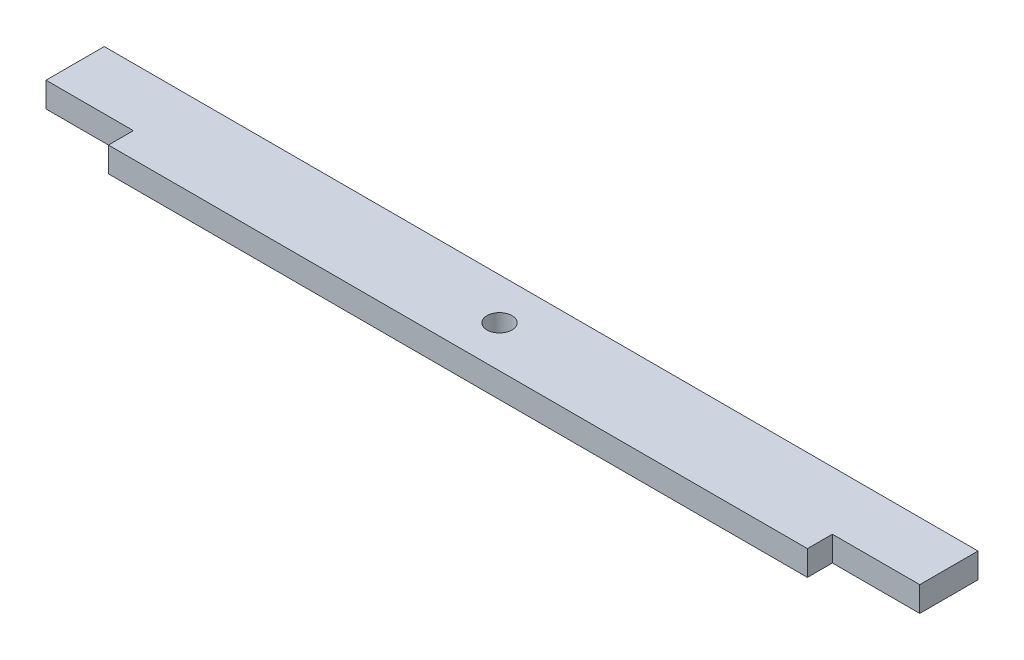
ISO-10303-21;
HEADER;
FILE_DESCRIPTION(('STEP AP214'),'2;1');
FILE_NAME('part.step','',(''),(''),'','','');
FILE_SCHEMA(('AUTOMOTIVE_DESIGN { 1 0 10303 214 1 1 1 1 }'));
ENDSEC;
DATA;
#1=APPLICATION_CONTEXT('core data for automotive mechanical design processes');
#2=APPLICATION_PROTOCOL_DEFINITION('international standard','automotive_design',2000,#1);
#3=PRODUCT_CONTEXT('',#1,'mechanical');
#4=PRODUCT('Part','Part','',(#3));
#5=PRODUCT_RELATED_PRODUCT_CATEGORY('part','',(#4));
#6=PRODUCT_DEFINITION_FORMATION('','',#4);
#7=PRODUCT_DEFINITION_CONTEXT('part definition',#1,'design');
#8=PRODUCT_DEFINITION('design','',#6,#7);
#9=PRODUCT_DEFINITION_SHAPE('','',#8);
#10=(LENGTH_UNIT() NAMED_UNIT(*) SI_UNIT(.MILLI.,.METRE.));
#11=(NAMED_UNIT(*) PLANE_ANGLE_UNIT() SI_UNIT($,.RADIAN.));
#12=(NAMED_UNIT(*) SI_UNIT($,.STERADIAN.) SOLID_ANGLE_UNIT());
#13=UNCERTAINTY_MEASURE_WITH_UNIT(LENGTH_MEASURE(1.E-05),#10,'distance_accuracy_value','');
#14=(GEOMETRIC_REPRESENTATION_CONTEXT(3) GLOBAL_UNCERTAINTY_ASSIGNED_CONTEXT((#13)) GLOBAL_UNIT_ASSIGNED_CONTEXT((#10,
#11,#12)) REPRESENTATION_CONTEXT('',''));
#15=CARTESIAN_POINT('',(0.,0.,0.));
#16=DIRECTION('',(0.,0.,1.));
#17=DIRECTION('',(1.,0.,0.));
#18=AXIS2_PLACEMENT_3D('',#15,#16,#17);
#19=CARTESIAN_POINT('',(0.,3.,0.));
#20=DIRECTION('',(0.,1.,0.));
#21=DIRECTION('',(0.,0.,1.));
#22=AXIS2_PLACEMENT_3D('',#19,#20,#21);
#23=PLANE('',#22);
#24=CARTESIAN_POINT('',(0.,3.,0.));
#25=DIRECTION('',(0.,1.,0.));
#26=DIRECTION('',(0.,0.,1.));
#27=AXIS2_PLACEMENT_3D('',#24,#25,#26);
#28=CIRCLE('',#27,1.5);
#29=CARTESIAN_POINT('',(0.,3.,1.5));
#30=VERTEX_POINT('',#29);
#31=EDGE_CURVE('E124',#30,#30,#28,.T.);
#32=ORIENTED_EDGE('',*,*,#31,.F.);
#33=EDGE_LOOP('',(#32));
#34=FACE_BOUND('',#33,.T.);
#35=DIRECTION('',(1.,0.,0.));
#36=VECTOR('',#35,1.);
#37=CARTESIAN_POINT('',(-52.5,3.,5.));
#38=LINE('',#37,#36);
#39=CARTESIAN_POINT('',(-42.,3.,5.));
#40=VERTEX_POINT('',#39);
#41=CARTESIAN_POINT('',(42.,3.,5.));
#42=VERTEX_POINT('',#41);
#43=EDGE_CURVE('E132',#40,#42,#38,.T.);
#44=ORIENTED_EDGE('',*,*,#43,.T.);
#45=DIRECTION('',(0.,0.,-1.));
#46=VECTOR('',#45,1.);
#47=CARTESIAN_POINT('',(42.,3.,5.));
#48=LINE('',#47,#46);
#49=CARTESIAN_POINT('',(42.,3.,2.));
#50=VERTEX_POINT('',#49);
#51=EDGE_CURVE('E52',#42,#50,#48,.T.);
#52=ORIENTED_EDGE('',*,*,#51,.T.);
#53=DIRECTION('',(1.,0.,0.));
#54=VECTOR('',#53,1.);
#55=CARTESIAN_POINT('',(42.,3.,2.));
#56=LINE('',#55,#54);
#57=CARTESIAN_POINT('',(52.5,3.,2.));
#58=VERTEX_POINT('',#57);
#59=EDGE_CURVE('E176',#50,#58,#56,.T.);
#60=ORIENTED_EDGE('',*,*,#59,.T.);
#61=DIRECTION('',(0.,0.,-1.));
#62=VECTOR('',#61,1.);
#63=CARTESIAN_POINT('',(52.5,3.,-5.));
#64=LINE('',#63,#62);
#65=CARTESIAN_POINT('',(52.5,3.,-5.));
#66=VERTEX_POINT('',#65);
#67=EDGE_CURVE('E119',#58,#66,#64,.T.);
#68=ORIENTED_EDGE('',*,*,#67,.T.);
#69=DIRECTION('',(-1.,0.,0.));
#70=VECTOR('',#69,1.);
#71=CARTESIAN_POINT('',(-52.5,3.,-5.));
#72=LINE('',#71,#70);
#73=CARTESIAN_POINT('',(-52.5,3.,-5.));
#74=VERTEX_POINT('',#73);
#75=EDGE_CURVE('E149',#66,#74,#72,.T.);
#76=ORIENTED_EDGE('',*,*,#75,.T.);
#77=DIRECTION('',(0.,0.,1.));
#78=VECTOR('',#77,1.);
#79=CARTESIAN_POINT('',(-52.5,3.,-5.));
#80=LINE('',#79,#78);
#81=CARTESIAN_POINT('',(-52.5,3.,2.));
#82=VERTEX_POINT('',#81);
#83=EDGE_CURVE('E144',#74,#82,#80,.T.);
#84=ORIENTED_EDGE('',*,*,#83,.T.);
#85=DIRECTION('',(-1.,0.,0.));
#86=VECTOR('',#85,1.);
#87=CARTESIAN_POINT('',(-42.,3.,2.));
#88=LINE('',#87,#86);
#89=CARTESIAN_POINT('',(-42.,3.,2.));
#90=VERTEX_POINT('',#89);
#91=EDGE_CURVE('E164',#90,#82,#88,.T.);
#92=ORIENTED_EDGE('',*,*,#91,.F.);
#93=DIRECTION('',(0.,0.,-1.));
#94=VECTOR('',#93,1.);
#95=CARTESIAN_POINT('',(-42.,3.,5.));
#96=LINE('',#95,#94);
#97=EDGE_CURVE('E166',#40,#90,#96,.T.);
#98=ORIENTED_EDGE('',*,*,#97,.F.);
#99=EDGE_LOOP('',(#44,#52,#60,#68,#76,#84,#92,#98));
#100=FACE_BOUND('',#99,.T.);
#101=ADVANCED_FACE('F37',(#34,#100),#23,.T.);
#102=CARTESIAN_POINT('',(0.,0.,0.));
#103=DIRECTION('',(0.,1.,0.));
#104=DIRECTION('',(0.,0.,1.));
#105=AXIS2_PLACEMENT_3D('',#102,#103,#104);
#106=PLANE('',#105);
#107=CARTESIAN_POINT('',(0.,0.,0.));
#108=DIRECTION('',(0.,1.,0.));
#109=DIRECTION('',(0.,0.,1.));
#110=AXIS2_PLACEMENT_3D('',#107,#108,#109);
#111=CIRCLE('',#110,1.5);
#112=CARTESIAN_POINT('',(0.,0.,1.5));
#113=VERTEX_POINT('',#112);
#114=EDGE_CURVE('E129',#113,#113,#111,.T.);
#115=ORIENTED_EDGE('',*,*,#114,.T.);
#116=EDGE_LOOP('',(#115));
#117=FACE_BOUND('',#116,.T.);
#118=DIRECTION('',(0.,0.,-1.));
#119=VECTOR('',#118,1.);
#120=CARTESIAN_POINT('',(42.,0.,5.));
#121=LINE('',#120,#119);
#122=CARTESIAN_POINT('',(42.,0.,5.));
#123=VERTEX_POINT('',#122);
#124=CARTESIAN_POINT('',(42.,0.,2.));
#125=VERTEX_POINT('',#124);
#126=EDGE_CURVE('E112',#123,#125,#121,.T.);
#127=ORIENTED_EDGE('',*,*,#126,.F.);
#128=DIRECTION('',(1.,0.,0.));
#129=VECTOR('',#128,1.);
#130=CARTESIAN_POINT('',(-52.5,0.,5.));
#131=LINE('',#130,#129);
#132=CARTESIAN_POINT('',(-42.,0.,5.));
#133=VERTEX_POINT('',#132);
#134=EDGE_CURVE('E137',#133,#123,#131,.T.);
#135=ORIENTED_EDGE('',*,*,#134,.F.);
#136=DIRECTION('',(0.,0.,-1.));
#137=VECTOR('',#136,1.);
#138=CARTESIAN_POINT('',(-42.,0.,5.));
#139=LINE('',#138,#137);
#140=CARTESIAN_POINT('',(-42.,0.,2.));
#141=VERTEX_POINT('',#140);
#142=EDGE_CURVE('E60',#133,#141,#139,.T.);
#143=ORIENTED_EDGE('',*,*,#142,.T.);
#144=DIRECTION('',(-1.,0.,0.));
#145=VECTOR('',#144,1.);
#146=CARTESIAN_POINT('',(-42.,0.,2.));
#147=LINE('',#146,#145);
#148=CARTESIAN_POINT('',(-52.5,0.,2.));
#149=VERTEX_POINT('',#148);
#150=EDGE_CURVE('E160',#141,#149,#147,.T.);
#151=ORIENTED_EDGE('',*,*,#150,.T.);
#152=DIRECTION('',(0.,0.,1.));
#153=VECTOR('',#152,1.);
#154=CARTESIAN_POINT('',(-52.5,0.,-5.));
#155=LINE('',#154,#153);
#156=CARTESIAN_POINT('',(-52.5,0.,-5.));
#157=VERTEX_POINT('',#156);
#158=EDGE_CURVE('E126',#157,#149,#155,.T.);
#159=ORIENTED_EDGE('',*,*,#158,.F.);
#160=DIRECTION('',(-1.,0.,0.));
#161=VECTOR('',#160,1.);
#162=CARTESIAN_POINT('',(-52.5,0.,-5.));
#163=LINE('',#162,#161);
#164=CARTESIAN_POINT('',(52.5,0.,-5.));
#165=VERTEX_POINT('',#164);
#166=EDGE_CURVE('E123',#165,#157,#163,.T.);
#167=ORIENTED_EDGE('',*,*,#166,.F.);
#168=DIRECTION('',(0.,0.,-1.));
#169=VECTOR('',#168,1.);
#170=CARTESIAN_POINT('',(52.5,0.,-5.));
#171=LINE('',#170,#169);
#172=CARTESIAN_POINT('',(52.5,0.,2.));
#173=VERTEX_POINT('',#172);
#174=EDGE_CURVE('E117',#173,#165,#171,.T.);
#175=ORIENTED_EDGE('',*,*,#174,.F.);
#176=DIRECTION('',(1.,0.,0.));
#177=VECTOR('',#176,1.);
#178=CARTESIAN_POINT('',(42.,0.,2.));
#179=LINE('',#178,#177);
#180=EDGE_CURVE('E102',#125,#173,#179,.T.);
#181=ORIENTED_EDGE('',*,*,#180,.F.);
#182=EDGE_LOOP('',(#127,#135,#143,#151,#159,#167,#175,#181));
#183=FACE_BOUND('',#182,.T.);
#184=ADVANCED_FACE('F121',(#117,#183),#106,.F.);
#185=CARTESIAN_POINT('',(52.5,3.,-5.));
#186=DIRECTION('',(-1.,0.,0.));
#187=DIRECTION('',(0.,0.,1.));
#188=AXIS2_PLACEMENT_3D('',#185,#186,#187);
#189=PLANE('',#188);
#190=DIRECTION('',(0.,1.,0.));
#191=VECTOR('',#190,1.);
#192=CARTESIAN_POINT('',(52.5,0.,2.));
#193=LINE('',#192,#191);
#194=EDGE_CURVE('E106',#173,#58,#193,.T.);
#195=ORIENTED_EDGE('',*,*,#194,.F.);
#196=ORIENTED_EDGE('',*,*,#174,.T.);
#197=DIRECTION('',(0.,-1.,0.));
#198=VECTOR('',#197,1.);
#199=CARTESIAN_POINT('',(52.5,3.,-5.));
#200=LINE('',#199,#198);
#201=EDGE_CURVE('E11',#66,#165,#200,.T.);
#202=ORIENTED_EDGE('',*,*,#201,.F.);
#203=ORIENTED_EDGE('',*,*,#67,.F.);
#204=EDGE_LOOP('',(#195,#196,#202,#203));
#205=FACE_BOUND('',#204,.T.);
#206=ADVANCED_FACE('F39',(#205),#189,.F.);
#207=CARTESIAN_POINT('',(-52.5,3.,5.));
#208=DIRECTION('',(0.,0.,-1.));
#209=DIRECTION('',(-1.,0.,0.));
#210=AXIS2_PLACEMENT_3D('',#207,#208,#209);
#211=PLANE('',#210);
#212=DIRECTION('',(0.,1.,0.));
#213=VECTOR('',#212,1.);
#214=CARTESIAN_POINT('',(42.,0.,5.));
#215=LINE('',#214,#213);
#216=EDGE_CURVE('E169',#123,#42,#215,.T.);
#217=ORIENTED_EDGE('',*,*,#216,.T.);
#218=ORIENTED_EDGE('',*,*,#43,.F.);
#219=DIRECTION('',(0.,1.,0.));
#220=VECTOR('',#219,1.);
#221=CARTESIAN_POINT('',(-42.,0.,5.));
#222=LINE('',#221,#220);
#223=EDGE_CURVE('E157',#133,#40,#222,.T.);
#224=ORIENTED_EDGE('',*,*,#223,.F.);
#225=ORIENTED_EDGE('',*,*,#134,.T.);
#226=EDGE_LOOP('',(#217,#218,#224,#225));
#227=FACE_BOUND('',#226,.T.);
#228=ADVANCED_FACE('F181',(#227),#211,.F.);
#229=CARTESIAN_POINT('',(-52.5,3.,-5.));
#230=DIRECTION('',(0.,0.,1.));
#231=DIRECTION('',(1.,0.,0.));
#232=AXIS2_PLACEMENT_3D('',#229,#230,#231);
#233=PLANE('',#232);
#234=ORIENTED_EDGE('',*,*,#166,.T.);
#235=DIRECTION('',(0.,-1.,0.));
#236=VECTOR('',#235,1.);
#237=CARTESIAN_POINT('',(-52.5,3.,-5.));
#238=LINE('',#237,#236);
#239=EDGE_CURVE('E45',#74,#157,#238,.T.);
#240=ORIENTED_EDGE('',*,*,#239,.F.);
#241=ORIENTED_EDGE('',*,*,#75,.F.);
#242=ORIENTED_EDGE('',*,*,#201,.T.);
#243=EDGE_LOOP('',(#234,#240,#241,#242));
#244=FACE_BOUND('',#243,.T.);
#245=ADVANCED_FACE('F189',(#244),#233,.F.);
#246=CARTESIAN_POINT('',(-52.5,3.,-5.));
#247=DIRECTION('',(1.,0.,0.));
#248=DIRECTION('',(0.,0.,-1.));
#249=AXIS2_PLACEMENT_3D('',#246,#247,#248);
#250=PLANE('',#249);
#251=ORIENTED_EDGE('',*,*,#158,.T.);
#252=DIRECTION('',(0.,1.,0.));
#253=VECTOR('',#252,1.);
#254=CARTESIAN_POINT('',(-52.5,0.,2.));
#255=LINE('',#254,#253);
#256=EDGE_CURVE('E155',#149,#82,#255,.T.);
#257=ORIENTED_EDGE('',*,*,#256,.T.);
#258=ORIENTED_EDGE('',*,*,#83,.F.);
#259=ORIENTED_EDGE('',*,*,#239,.T.);
#260=EDGE_LOOP('',(#251,#257,#258,#259));
#261=FACE_BOUND('',#260,.T.);
#262=ADVANCED_FACE('F186',(#261),#250,.F.);
#263=CARTESIAN_POINT('',(0.,3.,0.));
#264=DIRECTION('',(0.,-1.,0.));
#265=DIRECTION('',(0.,0.,-1.));
#266=AXIS2_PLACEMENT_3D('',#263,#264,#265);
#267=CYLINDRICAL_SURFACE('',#266,1.5);
#268=ORIENTED_EDGE('',*,*,#31,.T.);
#269=EDGE_LOOP('',(#268));
#270=FACE_BOUND('',#269,.T.);
#271=ORIENTED_EDGE('',*,*,#114,.F.);
#272=EDGE_LOOP('',(#271));
#273=FACE_BOUND('',#272,.T.);
#274=ADVANCED_FACE('F188',(#270,#273),#267,.F.);
#275=CARTESIAN_POINT('',(-42.,0.,2.));
#276=DIRECTION('',(0.,0.,-1.));
#277=DIRECTION('',(-1.,0.,0.));
#278=AXIS2_PLACEMENT_3D('',#275,#276,#277);
#279=PLANE('',#278);
#280=ORIENTED_EDGE('',*,*,#91,.T.);
#281=ORIENTED_EDGE('',*,*,#256,.F.);
#282=ORIENTED_EDGE('',*,*,#150,.F.);
#283=DIRECTION('',(0.,1.,0.));
#284=VECTOR('',#283,1.);
#285=CARTESIAN_POINT('',(-42.,0.,2.));
#286=LINE('',#285,#284);
#287=EDGE_CURVE('E159',#141,#90,#286,.T.);
#288=ORIENTED_EDGE('',*,*,#287,.T.);
#289=EDGE_LOOP('',(#280,#281,#282,#288));
#290=FACE_BOUND('',#289,.T.);
#291=ADVANCED_FACE('F184',(#290),#279,.F.);
#292=CARTESIAN_POINT('',(-42.,0.,5.));
#293=DIRECTION('',(1.,0.,0.));
#294=DIRECTION('',(0.,0.,-1.));
#295=AXIS2_PLACEMENT_3D('',#292,#293,#294);
#296=PLANE('',#295);
#297=ORIENTED_EDGE('',*,*,#97,.T.);
#298=ORIENTED_EDGE('',*,*,#287,.F.);
#299=ORIENTED_EDGE('',*,*,#142,.F.);
#300=ORIENTED_EDGE('',*,*,#223,.T.);
#301=EDGE_LOOP('',(#297,#298,#299,#300));
#302=FACE_BOUND('',#301,.T.);
#303=ADVANCED_FACE('F182',(#302),#296,.F.);
#304=CARTESIAN_POINT('',(42.,0.,5.));
#305=DIRECTION('',(1.,0.,0.));
#306=DIRECTION('',(0.,0.,-1.));
#307=AXIS2_PLACEMENT_3D('',#304,#305,#306);
#308=PLANE('',#307);
#309=ORIENTED_EDGE('',*,*,#51,.F.);
#310=ORIENTED_EDGE('',*,*,#216,.F.);
#311=ORIENTED_EDGE('',*,*,#126,.T.);
#312=DIRECTION('',(0.,1.,0.));
#313=VECTOR('',#312,1.);
#314=CARTESIAN_POINT('',(42.,0.,2.));
#315=LINE('',#314,#313);
#316=EDGE_CURVE('E108',#125,#50,#315,.T.);
#317=ORIENTED_EDGE('',*,*,#316,.T.);
#318=EDGE_LOOP('',(#309,#310,#311,#317));
#319=FACE_BOUND('',#318,.T.);
#320=ADVANCED_FACE('F178',(#319),#308,.T.);
#321=CARTESIAN_POINT('',(42.,0.,2.));
#322=DIRECTION('',(0.,0.,1.));
#323=DIRECTION('',(1.,0.,0.));
#324=AXIS2_PLACEMENT_3D('',#321,#322,#323);
#325=PLANE('',#324);
#326=ORIENTED_EDGE('',*,*,#59,.F.);
#327=ORIENTED_EDGE('',*,*,#316,.F.);
#328=ORIENTED_EDGE('',*,*,#180,.T.);
#329=ORIENTED_EDGE('',*,*,#194,.T.);
#330=EDGE_LOOP('',(#326,#327,#328,#329));
#331=FACE_BOUND('',#330,.T.);
#332=ADVANCED_FACE('F105',(#331),#325,.T.);
#333=CLOSED_SHELL('',(#101,#184,#206,#228,#245,#262,#274,#291,#303,#320,#332));
#334=MANIFOLD_SOLID_BREP('B2',#333);
#335=ADVANCED_BREP_SHAPE_REPRESENTATION('',(#18,#334),#14);
#336=SHAPE_DEFINITION_REPRESENTATION(#9,#335);
ENDSEC;
END-ISO-10303-21;
